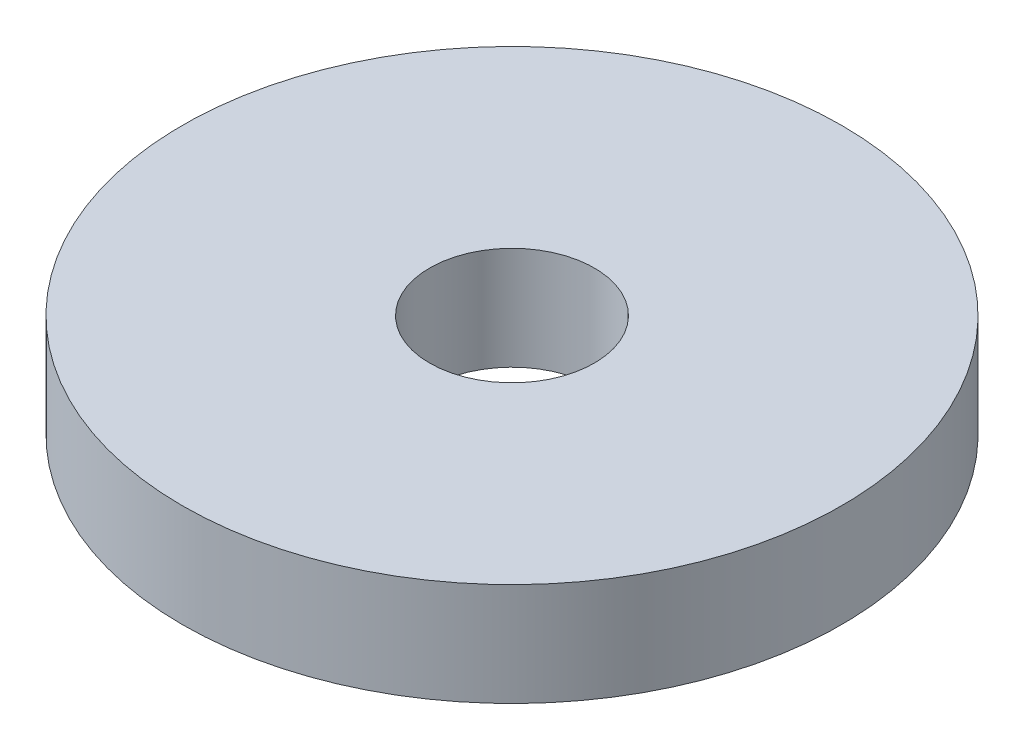
ISO-10303-21;
HEADER;
FILE_DESCRIPTION(('STEP AP214'),'2;1');
FILE_NAME('part.step','',(''),(''),'','','');
FILE_SCHEMA(('AUTOMOTIVE_DESIGN { 1 0 10303 214 1 1 1 1 }'));
ENDSEC;
DATA;
#1=APPLICATION_CONTEXT('core data for automotive mechanical design processes');
#2=APPLICATION_PROTOCOL_DEFINITION('international standard','automotive_design',2000,#1);
#3=PRODUCT_CONTEXT('',#1,'mechanical');
#4=PRODUCT('Part','Part','',(#3));
#5=PRODUCT_RELATED_PRODUCT_CATEGORY('part','',(#4));
#6=PRODUCT_DEFINITION_FORMATION('','',#4);
#7=PRODUCT_DEFINITION_CONTEXT('part definition',#1,'design');
#8=PRODUCT_DEFINITION('design','',#6,#7);
#9=PRODUCT_DEFINITION_SHAPE('','',#8);
#10=(LENGTH_UNIT() NAMED_UNIT(*) SI_UNIT(.MILLI.,.METRE.));
#11=(NAMED_UNIT(*) PLANE_ANGLE_UNIT() SI_UNIT($,.RADIAN.));
#12=(NAMED_UNIT(*) SI_UNIT($,.STERADIAN.) SOLID_ANGLE_UNIT());
#13=UNCERTAINTY_MEASURE_WITH_UNIT(LENGTH_MEASURE(1.E-05),#10,'distance_accuracy_value','');
#14=(GEOMETRIC_REPRESENTATION_CONTEXT(3) GLOBAL_UNCERTAINTY_ASSIGNED_CONTEXT((#13)) GLOBAL_UNIT_ASSIGNED_CONTEXT((#10,
#11,#12)) REPRESENTATION_CONTEXT('',''));
#15=CARTESIAN_POINT('',(0.,0.,0.));
#16=DIRECTION('',(0.,0.,1.));
#17=DIRECTION('',(1.,0.,0.));
#18=AXIS2_PLACEMENT_3D('',#15,#16,#17);
#19=CARTESIAN_POINT('',(0.,5.,0.));
#20=DIRECTION('',(0.,1.,0.));
#21=DIRECTION('',(0.,0.,1.));
#22=AXIS2_PLACEMENT_3D('',#19,#20,#21);
#23=PLANE('',#22);
#24=CARTESIAN_POINT('',(0.,5.,0.));
#25=DIRECTION('',(0.,1.,0.));
#26=DIRECTION('',(0.,0.,1.));
#27=AXIS2_PLACEMENT_3D('',#24,#25,#26);
#28=CIRCLE('',#27,16.);
#29=CARTESIAN_POINT('',(0.,5.,16.));
#30=VERTEX_POINT('',#29);
#31=EDGE_CURVE('E10',#30,#30,#28,.T.);
#32=ORIENTED_EDGE('',*,*,#31,.T.);
#33=EDGE_LOOP('',(#32));
#34=FACE_BOUND('',#33,.T.);
#35=CARTESIAN_POINT('',(0.,5.,0.));
#36=DIRECTION('',(0.,1.,0.));
#37=DIRECTION('',(0.,0.,1.));
#38=AXIS2_PLACEMENT_3D('',#35,#36,#37);
#39=CIRCLE('',#38,4.);
#40=CARTESIAN_POINT('',(0.,5.,4.));
#41=VERTEX_POINT('',#40);
#42=EDGE_CURVE('E42',#41,#41,#39,.T.);
#43=ORIENTED_EDGE('',*,*,#42,.F.);
#44=EDGE_LOOP('',(#43));
#45=FACE_BOUND('',#44,.T.);
#46=ADVANCED_FACE('F31',(#34,#45),#23,.T.);
#47=CARTESIAN_POINT('',(0.,0.,0.));
#48=DIRECTION('',(0.,1.,0.));
#49=DIRECTION('',(0.,0.,1.));
#50=AXIS2_PLACEMENT_3D('',#47,#48,#49);
#51=PLANE('',#50);
#52=CARTESIAN_POINT('',(0.,0.,0.));
#53=DIRECTION('',(0.,1.,0.));
#54=DIRECTION('',(0.,0.,1.));
#55=AXIS2_PLACEMENT_3D('',#52,#53,#54);
#56=CIRCLE('',#55,16.);
#57=CARTESIAN_POINT('',(0.,0.,16.));
#58=VERTEX_POINT('',#57);
#59=EDGE_CURVE('E35',#58,#58,#56,.T.);
#60=ORIENTED_EDGE('',*,*,#59,.F.);
#61=EDGE_LOOP('',(#60));
#62=FACE_BOUND('',#61,.T.);
#63=CARTESIAN_POINT('',(0.,0.,0.));
#64=DIRECTION('',(0.,1.,0.));
#65=DIRECTION('',(0.,0.,1.));
#66=AXIS2_PLACEMENT_3D('',#63,#64,#65);
#67=CIRCLE('',#66,4.);
#68=CARTESIAN_POINT('',(0.,0.,4.));
#69=VERTEX_POINT('',#68);
#70=EDGE_CURVE('E44',#69,#69,#67,.T.);
#71=ORIENTED_EDGE('',*,*,#70,.T.);
#72=EDGE_LOOP('',(#71));
#73=FACE_BOUND('',#72,.T.);
#74=ADVANCED_FACE('F54',(#62,#73),#51,.F.);
#75=CARTESIAN_POINT('',(0.,5.,0.));
#76=DIRECTION('',(0.,-1.,0.));
#77=DIRECTION('',(0.,0.,-1.));
#78=AXIS2_PLACEMENT_3D('',#75,#76,#77);
#79=CYLINDRICAL_SURFACE('',#78,16.);
#80=ORIENTED_EDGE('',*,*,#31,.F.);
#81=EDGE_LOOP('',(#80));
#82=FACE_BOUND('',#81,.T.);
#83=ORIENTED_EDGE('',*,*,#59,.T.);
#84=EDGE_LOOP('',(#83));
#85=FACE_BOUND('',#84,.T.);
#86=ADVANCED_FACE('F33',(#82,#85),#79,.T.);
#87=CARTESIAN_POINT('',(0.,5.,0.));
#88=DIRECTION('',(0.,-1.,0.));
#89=DIRECTION('',(0.,0.,-1.));
#90=AXIS2_PLACEMENT_3D('',#87,#88,#89);
#91=CYLINDRICAL_SURFACE('',#90,4.);
#92=ORIENTED_EDGE('',*,*,#42,.T.);
#93=EDGE_LOOP('',(#92));
#94=FACE_BOUND('',#93,.T.);
#95=ORIENTED_EDGE('',*,*,#70,.F.);
#96=EDGE_LOOP('',(#95));
#97=FACE_BOUND('',#96,.T.);
#98=ADVANCED_FACE('F50',(#94,#97),#91,.F.);
#99=CLOSED_SHELL('',(#46,#74,#86,#98));
#100=MANIFOLD_SOLID_BREP('B2',#99);
#101=ADVANCED_BREP_SHAPE_REPRESENTATION('',(#18,#100),#14);
#102=SHAPE_DEFINITION_REPRESENTATION(#9,#101);
ENDSEC;
END-ISO-10303-21;
